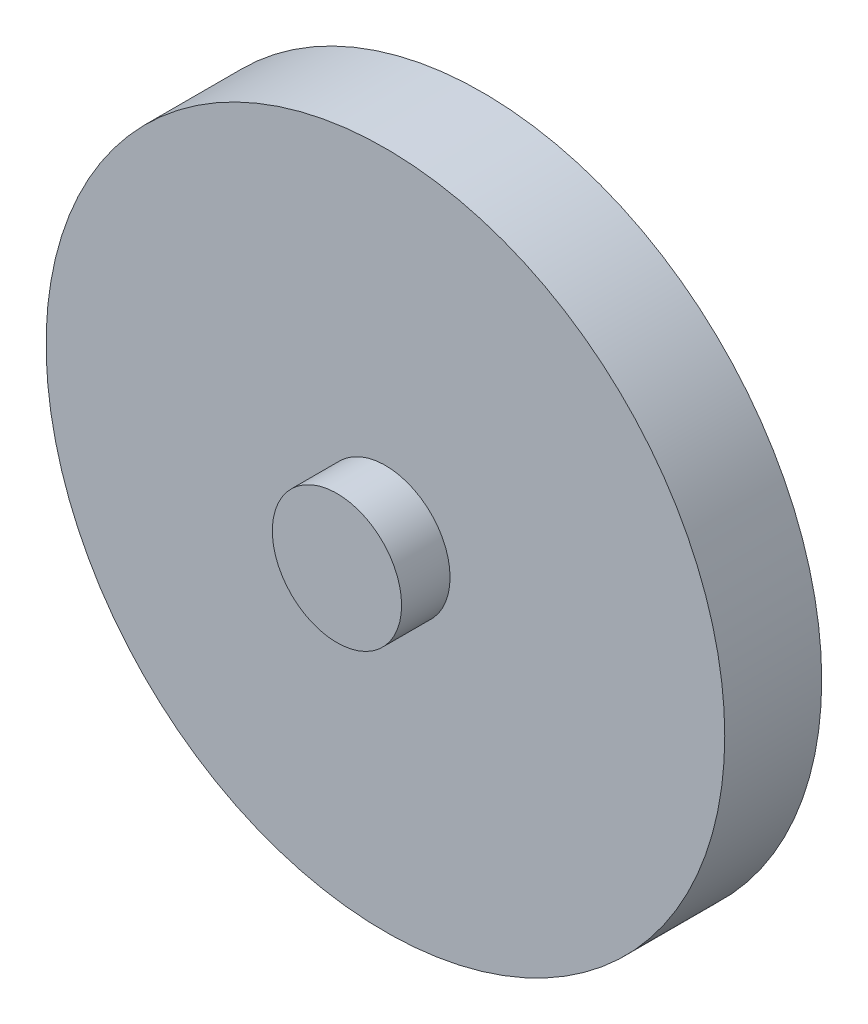
ISO-10303-21;
HEADER;
FILE_DESCRIPTION(('STEP AP214'),'2;1');
FILE_NAME('part.step','',(''),(''),'','','');
FILE_SCHEMA(('AUTOMOTIVE_DESIGN { 1 0 10303 214 1 1 1 1 }'));
ENDSEC;
DATA;
#1=APPLICATION_CONTEXT('core data for automotive mechanical design processes');
#2=APPLICATION_PROTOCOL_DEFINITION('international standard','automotive_design',2000,#1);
#3=PRODUCT_CONTEXT('',#1,'mechanical');
#4=PRODUCT('Part','Part','',(#3));
#5=PRODUCT_RELATED_PRODUCT_CATEGORY('part','',(#4));
#6=PRODUCT_DEFINITION_FORMATION('','',#4);
#7=PRODUCT_DEFINITION_CONTEXT('part definition',#1,'design');
#8=PRODUCT_DEFINITION('design','',#6,#7);
#9=PRODUCT_DEFINITION_SHAPE('','',#8);
#10=(LENGTH_UNIT() NAMED_UNIT(*) SI_UNIT(.MILLI.,.METRE.));
#11=(NAMED_UNIT(*) PLANE_ANGLE_UNIT() SI_UNIT($,.RADIAN.));
#12=(NAMED_UNIT(*) SI_UNIT($,.STERADIAN.) SOLID_ANGLE_UNIT());
#13=UNCERTAINTY_MEASURE_WITH_UNIT(LENGTH_MEASURE(1.E-05),#10,'distance_accuracy_value','');
#14=(GEOMETRIC_REPRESENTATION_CONTEXT(3) GLOBAL_UNCERTAINTY_ASSIGNED_CONTEXT((#13)) GLOBAL_UNIT_ASSIGNED_CONTEXT((#10,
#11,#12)) REPRESENTATION_CONTEXT('',''));
#15=CARTESIAN_POINT('',(0.,0.,0.));
#16=DIRECTION('',(0.,0.,1.));
#17=DIRECTION('',(1.,0.,0.));
#18=AXIS2_PLACEMENT_3D('',#15,#16,#17);
#19=CARTESIAN_POINT('',(0.,0.,6.));
#20=DIRECTION('',(0.,0.,-1.));
#21=DIRECTION('',(-1.,0.,0.));
#22=AXIS2_PLACEMENT_3D('',#19,#20,#21);
#23=CYLINDRICAL_SURFACE('',#22,8.);
#24=CARTESIAN_POINT('',(0.,0.,6.));
#25=DIRECTION('',(0.,0.,1.));
#26=DIRECTION('',(1.,0.,0.));
#27=AXIS2_PLACEMENT_3D('',#24,#25,#26);
#28=CIRCLE('',#27,8.);
#29=CARTESIAN_POINT('',(8.,0.,6.));
#30=VERTEX_POINT('',#29);
#31=EDGE_CURVE('E44',#30,#30,#28,.T.);
#32=ORIENTED_EDGE('',*,*,#31,.F.);
#33=EDGE_LOOP('',(#32));
#34=FACE_BOUND('',#33,.T.);
#35=CARTESIAN_POINT('',(0.,0.,0.));
#36=DIRECTION('',(0.,0.,1.));
#37=DIRECTION('',(1.,0.,0.));
#38=AXIS2_PLACEMENT_3D('',#35,#36,#37);
#39=CIRCLE('',#38,8.);
#40=CARTESIAN_POINT('',(8.,0.,0.));
#41=VERTEX_POINT('',#40);
#42=EDGE_CURVE('E40',#41,#41,#39,.T.);
#43=ORIENTED_EDGE('',*,*,#42,.T.);
#44=EDGE_LOOP('',(#43));
#45=FACE_BOUND('',#44,.T.);
#46=ADVANCED_FACE('F37',(#34,#45),#23,.T.);
#47=CARTESIAN_POINT('',(0.,0.,0.));
#48=DIRECTION('',(0.,0.,1.));
#49=DIRECTION('',(1.,0.,0.));
#50=AXIS2_PLACEMENT_3D('',#47,#48,#49);
#51=PLANE('',#50);
#52=ORIENTED_EDGE('',*,*,#42,.F.);
#53=EDGE_LOOP('',(#52));
#54=FACE_BOUND('',#53,.T.);
#55=ADVANCED_FACE('F79',(#54),#51,.F.);
#56=CARTESIAN_POINT('',(0.,0.,18.));
#57=DIRECTION('',(0.,0.,-1.));
#58=DIRECTION('',(-1.,0.,0.));
#59=AXIS2_PLACEMENT_3D('',#56,#57,#58);
#60=CYLINDRICAL_SURFACE('',#59,42.);
#61=CARTESIAN_POINT('',(0.,0.,18.));
#62=DIRECTION('',(0.,0.,1.));
#63=DIRECTION('',(1.,0.,0.));
#64=AXIS2_PLACEMENT_3D('',#61,#62,#63);
#65=CIRCLE('',#64,42.);
#66=CARTESIAN_POINT('',(42.,0.,18.));
#67=VERTEX_POINT('',#66);
#68=EDGE_CURVE('E52',#67,#67,#65,.T.);
#69=ORIENTED_EDGE('',*,*,#68,.F.);
#70=EDGE_LOOP('',(#69));
#71=FACE_BOUND('',#70,.T.);
#72=CARTESIAN_POINT('',(0.,0.,6.));
#73=DIRECTION('',(0.,0.,1.));
#74=DIRECTION('',(1.,0.,0.));
#75=AXIS2_PLACEMENT_3D('',#72,#73,#74);
#76=CIRCLE('',#75,42.);
#77=CARTESIAN_POINT('',(42.,0.,6.));
#78=VERTEX_POINT('',#77);
#79=EDGE_CURVE('E55',#78,#78,#76,.T.);
#80=ORIENTED_EDGE('',*,*,#79,.T.);
#81=EDGE_LOOP('',(#80));
#82=FACE_BOUND('',#81,.T.);
#83=ADVANCED_FACE('F84',(#71,#82),#60,.T.);
#84=CARTESIAN_POINT('',(0.,0.,18.));
#85=DIRECTION('',(0.,0.,1.));
#86=DIRECTION('',(1.,0.,0.));
#87=AXIS2_PLACEMENT_3D('',#84,#85,#86);
#88=PLANE('',#87);
#89=CARTESIAN_POINT('',(0.,0.,18.));
#90=DIRECTION('',(0.,0.,1.));
#91=DIRECTION('',(1.,0.,0.));
#92=AXIS2_PLACEMENT_3D('',#89,#90,#91);
#93=CIRCLE('',#92,8.);
#94=CARTESIAN_POINT('',(8.,0.,18.));
#95=VERTEX_POINT('',#94);
#96=EDGE_CURVE('E10',#95,#95,#93,.T.);
#97=ORIENTED_EDGE('',*,*,#96,.F.);
#98=EDGE_LOOP('',(#97));
#99=FACE_BOUND('',#98,.T.);
#100=ORIENTED_EDGE('',*,*,#68,.T.);
#101=EDGE_LOOP('',(#100));
#102=FACE_BOUND('',#101,.T.);
#103=ADVANCED_FACE('F74',(#99,#102),#88,.T.);
#104=CARTESIAN_POINT('',(0.,0.,6.));
#105=DIRECTION('',(0.,0.,1.));
#106=DIRECTION('',(1.,0.,0.));
#107=AXIS2_PLACEMENT_3D('',#104,#105,#106);
#108=PLANE('',#107);
#109=ORIENTED_EDGE('',*,*,#31,.T.);
#110=EDGE_LOOP('',(#109));
#111=FACE_BOUND('',#110,.T.);
#112=ORIENTED_EDGE('',*,*,#79,.F.);
#113=EDGE_LOOP('',(#112));
#114=FACE_BOUND('',#113,.T.);
#115=ADVANCED_FACE('F66',(#111,#114),#108,.F.);
#116=CARTESIAN_POINT('',(0.,0.,24.));
#117=DIRECTION('',(0.,0.,-1.));
#118=DIRECTION('',(-1.,0.,0.));
#119=AXIS2_PLACEMENT_3D('',#116,#117,#118);
#120=CYLINDRICAL_SURFACE('',#119,8.);
#121=CARTESIAN_POINT('',(0.,0.,24.));
#122=DIRECTION('',(0.,0.,1.));
#123=DIRECTION('',(1.,0.,0.));
#124=AXIS2_PLACEMENT_3D('',#121,#122,#123);
#125=CIRCLE('',#124,8.);
#126=CARTESIAN_POINT('',(8.,0.,24.));
#127=VERTEX_POINT('',#126);
#128=EDGE_CURVE('E51',#127,#127,#125,.T.);
#129=ORIENTED_EDGE('',*,*,#128,.F.);
#130=EDGE_LOOP('',(#129));
#131=FACE_BOUND('',#130,.T.);
#132=ORIENTED_EDGE('',*,*,#96,.T.);
#133=EDGE_LOOP('',(#132));
#134=FACE_BOUND('',#133,.T.);
#135=ADVANCED_FACE('F64',(#131,#134),#120,.T.);
#136=CARTESIAN_POINT('',(0.,0.,24.));
#137=DIRECTION('',(0.,0.,1.));
#138=DIRECTION('',(1.,0.,0.));
#139=AXIS2_PLACEMENT_3D('',#136,#137,#138);
#140=PLANE('',#139);
#141=ORIENTED_EDGE('',*,*,#128,.T.);
#142=EDGE_LOOP('',(#141));
#143=FACE_BOUND('',#142,.T.);
#144=ADVANCED_FACE('F62',(#143),#140,.T.);
#145=CLOSED_SHELL('',(#46,#55,#83,#103,#115,#135,#144));
#146=MANIFOLD_SOLID_BREP('B2',#145);
#147=ADVANCED_BREP_SHAPE_REPRESENTATION('',(#18,#146),#14);
#148=SHAPE_DEFINITION_REPRESENTATION(#9,#147);
ENDSEC;
END-ISO-10303-21;
